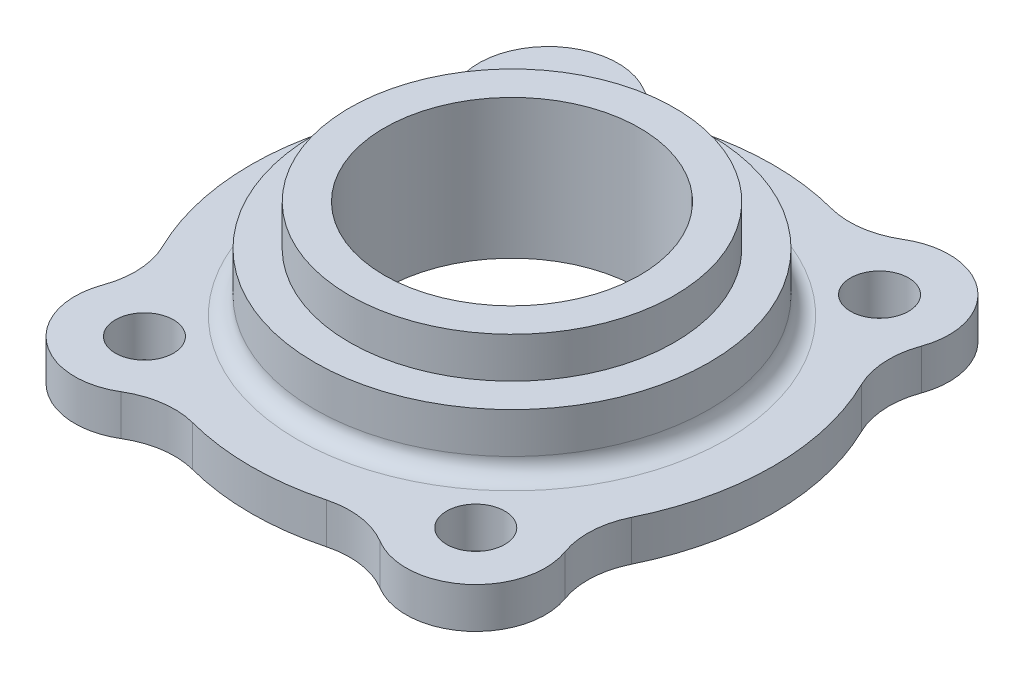
ISO-10303-21;
HEADER;
FILE_DESCRIPTION(('STEP AP214'),'2;1');
FILE_NAME('part.step','',(''),(''),'','','');
FILE_SCHEMA(('AUTOMOTIVE_DESIGN { 1 0 10303 214 1 1 1 1 }'));
ENDSEC;
DATA;
#1=APPLICATION_CONTEXT('core data for automotive mechanical design processes');
#2=APPLICATION_PROTOCOL_DEFINITION('international standard','automotive_design',2000,#1);
#3=PRODUCT_CONTEXT('',#1,'mechanical');
#4=PRODUCT('Part','Part','',(#3));
#5=PRODUCT_RELATED_PRODUCT_CATEGORY('part','',(#4));
#6=PRODUCT_DEFINITION_FORMATION('','',#4);
#7=PRODUCT_DEFINITION_CONTEXT('part definition',#1,'design');
#8=PRODUCT_DEFINITION('design','',#6,#7);
#9=PRODUCT_DEFINITION_SHAPE('','',#8);
#10=(LENGTH_UNIT() NAMED_UNIT(*) SI_UNIT(.MILLI.,.METRE.));
#11=(NAMED_UNIT(*) PLANE_ANGLE_UNIT() SI_UNIT($,.RADIAN.));
#12=(NAMED_UNIT(*) SI_UNIT($,.STERADIAN.) SOLID_ANGLE_UNIT());
#13=UNCERTAINTY_MEASURE_WITH_UNIT(LENGTH_MEASURE(1.E-05),#10,'distance_accuracy_value','');
#14=(GEOMETRIC_REPRESENTATION_CONTEXT(3) GLOBAL_UNCERTAINTY_ASSIGNED_CONTEXT((#13)) GLOBAL_UNIT_ASSIGNED_CONTEXT((#10,
#11,#12)) REPRESENTATION_CONTEXT('',''));
#15=CARTESIAN_POINT('',(0.,0.,0.));
#16=DIRECTION('',(0.,0.,1.));
#17=DIRECTION('',(1.,0.,0.));
#18=AXIS2_PLACEMENT_3D('',#15,#16,#17);
#19=CARTESIAN_POINT('',(0.,12.,0.));
#20=DIRECTION('',(0.,-1.,0.));
#21=DIRECTION('',(0.,0.,-1.));
#22=AXIS2_PLACEMENT_3D('',#19,#20,#21);
#23=CYLINDRICAL_SURFACE('',#22,11.);
#24=CARTESIAN_POINT('',(0.,12.,0.));
#25=DIRECTION('',(0.,1.,0.));
#26=DIRECTION('',(0.,0.,1.));
#27=AXIS2_PLACEMENT_3D('',#24,#25,#26);
#28=CIRCLE('',#27,11.);
#29=CARTESIAN_POINT('',(0.,12.,11.));
#30=VERTEX_POINT('',#29);
#31=EDGE_CURVE('E232',#30,#30,#28,.T.);
#32=ORIENTED_EDGE('',*,*,#31,.T.);
#33=EDGE_LOOP('',(#32));
#34=FACE_BOUND('',#33,.T.);
#35=CARTESIAN_POINT('',(0.,0.,0.));
#36=DIRECTION('',(0.,1.,0.));
#37=DIRECTION('',(0.,0.,1.));
#38=AXIS2_PLACEMENT_3D('',#35,#36,#37);
#39=CIRCLE('',#38,11.);
#40=CARTESIAN_POINT('',(0.,0.,11.));
#41=VERTEX_POINT('',#40);
#42=EDGE_CURVE('E231',#41,#41,#39,.T.);
#43=ORIENTED_EDGE('',*,*,#42,.F.);
#44=EDGE_LOOP('',(#43));
#45=FACE_BOUND('',#44,.T.);
#46=ADVANCED_FACE('F43',(#34,#45),#23,.F.);
#47=CARTESIAN_POINT('',(0.,12.,0.));
#48=DIRECTION('',(0.,-1.,0.));
#49=DIRECTION('',(0.,0.,-1.));
#50=AXIS2_PLACEMENT_3D('',#47,#48,#49);
#51=CYLINDRICAL_SURFACE('',#50,14.);
#52=CARTESIAN_POINT('',(0.,8.5,0.));
#53=DIRECTION('',(0.,1.,0.));
#54=DIRECTION('',(0.,0.,1.));
#55=AXIS2_PLACEMENT_3D('',#52,#53,#54);
#56=CIRCLE('',#55,14.);
#57=CARTESIAN_POINT('',(0.,8.5,14.));
#58=VERTEX_POINT('',#57);
#59=EDGE_CURVE('E223',#58,#58,#56,.T.);
#60=ORIENTED_EDGE('',*,*,#59,.T.);
#61=EDGE_LOOP('',(#60));
#62=FACE_BOUND('',#61,.T.);
#63=CARTESIAN_POINT('',(0.,12.,0.));
#64=DIRECTION('',(0.,1.,0.));
#65=DIRECTION('',(0.,0.,1.));
#66=AXIS2_PLACEMENT_3D('',#63,#64,#65);
#67=CIRCLE('',#66,14.);
#68=CARTESIAN_POINT('',(0.,12.,14.));
#69=VERTEX_POINT('',#68);
#70=EDGE_CURVE('E236',#69,#69,#67,.T.);
#71=ORIENTED_EDGE('',*,*,#70,.F.);
#72=EDGE_LOOP('',(#71));
#73=FACE_BOUND('',#72,.T.);
#74=ADVANCED_FACE('F421',(#62,#73),#51,.T.);
#75=CARTESIAN_POINT('',(0.,12.,0.));
#76=DIRECTION('',(0.,1.,0.));
#77=DIRECTION('',(0.,0.,1.));
#78=AXIS2_PLACEMENT_3D('',#75,#76,#77);
#79=PLANE('',#78);
#80=ORIENTED_EDGE('',*,*,#31,.F.);
#81=EDGE_LOOP('',(#80));
#82=FACE_BOUND('',#81,.T.);
#83=ORIENTED_EDGE('',*,*,#70,.T.);
#84=EDGE_LOOP('',(#83));
#85=FACE_BOUND('',#84,.T.);
#86=ADVANCED_FACE('F427',(#82,#85),#79,.T.);
#87=CARTESIAN_POINT('',(0.,0.,0.));
#88=DIRECTION('',(0.,1.,0.));
#89=DIRECTION('',(0.,0.,1.));
#90=AXIS2_PLACEMENT_3D('',#87,#88,#89);
#91=PLANE('',#90);
#92=ORIENTED_EDGE('',*,*,#42,.T.);
#93=EDGE_LOOP('',(#92));
#94=FACE_BOUND('',#93,.T.);
#95=CARTESIAN_POINT('',(0.,0.,0.));
#96=DIRECTION('',(0.,1.,0.));
#97=DIRECTION('',(0.,0.,1.));
#98=AXIS2_PLACEMENT_3D('',#95,#96,#97);
#99=CIRCLE('',#98,22.5);
#100=CARTESIAN_POINT('',(-5.75422966979241,0.,21.7517548925893));
#101=VERTEX_POINT('',#100);
#102=CARTESIAN_POINT('',(5.75422966979241,0.,21.7517548925893));
#103=VERTEX_POINT('',#102);
#104=EDGE_CURVE('E174',#101,#103,#99,.T.);
#105=ORIENTED_EDGE('',*,*,#104,.F.);
#106=CARTESIAN_POINT('',(-7.54443445595005,0.,28.5189675258393));
#107=DIRECTION('',(0.,1.,0.));
#108=DIRECTION('',(0.,0.,1.));
#109=AXIS2_PLACEMENT_3D('',#106,#107,#108);
#110=CIRCLE('',#109,7.);
#111=CARTESIAN_POINT('',(-11.1666398852666,0.,22.5290069393387));
#112=VERTEX_POINT('',#111);
#113=EDGE_CURVE('E157',#101,#112,#110,.T.);
#114=ORIENTED_EDGE('',*,*,#113,.T.);
#115=CARTESIAN_POINT('',(-14.2713873961094,0.,17.3947550080526));
#116=DIRECTION('',(0.,1.,0.));
#117=DIRECTION('',(0.,0.,1.));
#118=AXIS2_PLACEMENT_3D('',#115,#116,#117);
#119=CIRCLE('',#118,6.00000000000001);
#120=CARTESIAN_POINT('',(-19.9132704440383,0.,15.3529039670869));
#121=VERTEX_POINT('',#120);
#122=EDGE_CURVE('E220',#121,#112,#119,.T.);
#123=ORIENTED_EDGE('',*,*,#122,.F.);
#124=CARTESIAN_POINT('',(-26.4954673332886,0.,12.9707444192935));
#125=DIRECTION('',(0.,1.,0.));
#126=DIRECTION('',(0.,0.,1.));
#127=AXIS2_PLACEMENT_3D('',#124,#125,#126);
#128=CIRCLE('',#127,7.);
#129=CARTESIAN_POINT('',(-20.2084072881015,0.,9.89294065878321));
#130=VERTEX_POINT('',#129);
#131=EDGE_CURVE('E318',#121,#130,#128,.T.);
#132=ORIENTED_EDGE('',*,*,#131,.T.);
#133=CARTESIAN_POINT('',(0.,0.,0.));
#134=DIRECTION('',(0.,1.,0.));
#135=DIRECTION('',(0.,0.,1.));
#136=AXIS2_PLACEMENT_3D('',#133,#134,#135);
#137=CIRCLE('',#136,22.5);
#138=CARTESIAN_POINT('',(-20.2084072881015,0.,-9.89294065878322));
#139=VERTEX_POINT('',#138);
#140=EDGE_CURVE('E216',#139,#130,#137,.T.);
#141=ORIENTED_EDGE('',*,*,#140,.F.);
#142=CARTESIAN_POINT('',(-26.4954673332886,0.,-12.9707444192936));
#143=DIRECTION('',(0.,1.,0.));
#144=DIRECTION('',(0.,0.,1.));
#145=AXIS2_PLACEMENT_3D('',#142,#143,#144);
#146=CIRCLE('',#145,7.);
#147=CARTESIAN_POINT('',(-19.9132704440383,0.,-15.3529039670869));
#148=VERTEX_POINT('',#147);
#149=EDGE_CURVE('E324',#139,#148,#146,.T.);
#150=ORIENTED_EDGE('',*,*,#149,.T.);
#151=CARTESIAN_POINT('',(-14.2713873961094,0.,-17.3947550080526));
#152=DIRECTION('',(0.,1.,0.));
#153=DIRECTION('',(0.,0.,1.));
#154=AXIS2_PLACEMENT_3D('',#151,#152,#153);
#155=CIRCLE('',#154,5.99999999999999);
#156=CARTESIAN_POINT('',(-11.1666398852666,0.,-22.5290069393387));
#157=VERTEX_POINT('',#156);
#158=EDGE_CURVE('E212',#157,#148,#155,.T.);
#159=ORIENTED_EDGE('',*,*,#158,.F.);
#160=CARTESIAN_POINT('',(-7.54443445595007,0.,-28.5189675258392));
#161=DIRECTION('',(0.,1.,0.));
#162=DIRECTION('',(0.,0.,1.));
#163=AXIS2_PLACEMENT_3D('',#160,#161,#162);
#164=CIRCLE('',#163,7.);
#165=CARTESIAN_POINT('',(-5.75422966979243,0.,-21.7517548925893));
#166=VERTEX_POINT('',#165);
#167=EDGE_CURVE('E312',#157,#166,#164,.T.);
#168=ORIENTED_EDGE('',*,*,#167,.T.);
#169=CARTESIAN_POINT('',(0.,0.,0.));
#170=DIRECTION('',(0.,1.,0.));
#171=DIRECTION('',(0.,0.,1.));
#172=AXIS2_PLACEMENT_3D('',#169,#170,#171);
#173=CIRCLE('',#172,22.5);
#174=CARTESIAN_POINT('',(5.7542296697924,0.,-21.7517548925893));
#175=VERTEX_POINT('',#174);
#176=EDGE_CURVE('E208',#175,#166,#173,.T.);
#177=ORIENTED_EDGE('',*,*,#176,.F.);
#178=CARTESIAN_POINT('',(7.54443445595004,0.,-28.5189675258393));
#179=DIRECTION('',(0.,1.,0.));
#180=DIRECTION('',(0.,0.,1.));
#181=AXIS2_PLACEMENT_3D('',#178,#179,#180);
#182=CIRCLE('',#181,7.);
#183=CARTESIAN_POINT('',(11.1666398852666,0.,-22.5290069393387));
#184=VERTEX_POINT('',#183);
#185=EDGE_CURVE('E306',#175,#184,#182,.T.);
#186=ORIENTED_EDGE('',*,*,#185,.T.);
#187=CARTESIAN_POINT('',(14.2713873961094,0.,-17.3947550080526));
#188=DIRECTION('',(0.,1.,0.));
#189=DIRECTION('',(0.,0.,1.));
#190=AXIS2_PLACEMENT_3D('',#187,#188,#189);
#191=CIRCLE('',#190,6.00000000000001);
#192=CARTESIAN_POINT('',(19.9132704440383,0.,-15.3529039670869));
#193=VERTEX_POINT('',#192);
#194=EDGE_CURVE('E204',#193,#184,#191,.T.);
#195=ORIENTED_EDGE('',*,*,#194,.F.);
#196=CARTESIAN_POINT('',(26.4954673332886,0.,-12.9707444192935));
#197=DIRECTION('',(0.,1.,0.));
#198=DIRECTION('',(0.,0.,1.));
#199=AXIS2_PLACEMENT_3D('',#196,#197,#198);
#200=CIRCLE('',#199,7.);
#201=CARTESIAN_POINT('',(20.2084072881015,0.,-9.89294065878321));
#202=VERTEX_POINT('',#201);
#203=EDGE_CURVE('E330',#193,#202,#200,.T.);
#204=ORIENTED_EDGE('',*,*,#203,.T.);
#205=CARTESIAN_POINT('',(0.,0.,0.));
#206=DIRECTION('',(0.,1.,0.));
#207=DIRECTION('',(0.,0.,1.));
#208=AXIS2_PLACEMENT_3D('',#205,#206,#207);
#209=CIRCLE('',#208,22.5);
#210=CARTESIAN_POINT('',(20.2084072881015,0.,9.89294065878321));
#211=VERTEX_POINT('',#210);
#212=EDGE_CURVE('E193',#211,#202,#209,.T.);
#213=ORIENTED_EDGE('',*,*,#212,.F.);
#214=CARTESIAN_POINT('',(26.4954673332886,0.,12.9707444192935));
#215=DIRECTION('',(0.,1.,0.));
#216=DIRECTION('',(0.,0.,1.));
#217=AXIS2_PLACEMENT_3D('',#214,#215,#216);
#218=CIRCLE('',#217,7.);
#219=CARTESIAN_POINT('',(19.9132704440383,0.,15.3529039670869));
#220=VERTEX_POINT('',#219);
#221=EDGE_CURVE('E52',#211,#220,#218,.T.);
#222=ORIENTED_EDGE('',*,*,#221,.T.);
#223=CARTESIAN_POINT('',(14.2713873961094,0.,17.3947550080526));
#224=DIRECTION('',(0.,1.,0.));
#225=DIRECTION('',(0.,0.,1.));
#226=AXIS2_PLACEMENT_3D('',#223,#224,#225);
#227=CIRCLE('',#226,6.00000000000001);
#228=CARTESIAN_POINT('',(11.1666398852666,0.,22.5290069393387));
#229=VERTEX_POINT('',#228);
#230=EDGE_CURVE('E187',#229,#220,#227,.T.);
#231=ORIENTED_EDGE('',*,*,#230,.F.);
#232=CARTESIAN_POINT('',(7.54443445595005,0.,28.5189675258393));
#233=DIRECTION('',(0.,1.,0.));
#234=DIRECTION('',(0.,0.,1.));
#235=AXIS2_PLACEMENT_3D('',#232,#233,#234);
#236=CIRCLE('',#235,7.);
#237=EDGE_CURVE('E185',#229,#103,#236,.T.);
#238=ORIENTED_EDGE('',*,*,#237,.T.);
#239=EDGE_LOOP('',(#105,#114,#123,#132,#141,#150,#159,#168,#177,#186,#195,#204,#213,#222,#231,#238));
#240=FACE_BOUND('',#239,.T.);
#241=CARTESIAN_POINT('',(-14.2713873961094,0.,-17.3947550080526));
#242=DIRECTION('',(0.,1.,0.));
#243=DIRECTION('',(0.,0.,1.));
#244=AXIS2_PLACEMENT_3D('',#241,#242,#243);
#245=CIRCLE('',#244,2.5);
#246=CARTESIAN_POINT('',(-14.2713873961094,0.,-14.8947550080526));
#247=VERTEX_POINT('',#246);
#248=EDGE_CURVE('E196',#247,#247,#245,.T.);
#249=ORIENTED_EDGE('',*,*,#248,.T.);
#250=EDGE_LOOP('',(#249));
#251=FACE_BOUND('',#250,.T.);
#252=CARTESIAN_POINT('',(14.2713873961094,0.,-17.3947550080526));
#253=DIRECTION('',(0.,1.,0.));
#254=DIRECTION('',(0.,0.,1.));
#255=AXIS2_PLACEMENT_3D('',#252,#253,#254);
#256=CIRCLE('',#255,2.5);
#257=CARTESIAN_POINT('',(14.2713873961094,0.,-14.8947550080526));
#258=VERTEX_POINT('',#257);
#259=EDGE_CURVE('E687',#258,#258,#256,.T.);
#260=ORIENTED_EDGE('',*,*,#259,.T.);
#261=EDGE_LOOP('',(#260));
#262=FACE_BOUND('',#261,.T.);
#263=CARTESIAN_POINT('',(-14.2713873961094,0.,17.3947550080526));
#264=DIRECTION('',(0.,1.,0.));
#265=DIRECTION('',(0.,0.,1.));
#266=AXIS2_PLACEMENT_3D('',#263,#264,#265);
#267=CIRCLE('',#266,2.5);
#268=CARTESIAN_POINT('',(-14.2713873961094,0.,19.8947550080526));
#269=VERTEX_POINT('',#268);
#270=EDGE_CURVE('E697',#269,#269,#267,.T.);
#271=ORIENTED_EDGE('',*,*,#270,.T.);
#272=EDGE_LOOP('',(#271));
#273=FACE_BOUND('',#272,.T.);
#274=CARTESIAN_POINT('',(14.2713873961094,0.,17.3947550080526));
#275=DIRECTION('',(0.,1.,0.));
#276=DIRECTION('',(0.,0.,1.));
#277=AXIS2_PLACEMENT_3D('',#274,#275,#276);
#278=CIRCLE('',#277,2.5);
#279=CARTESIAN_POINT('',(14.2713873961094,0.,19.8947550080526));
#280=VERTEX_POINT('',#279);
#281=EDGE_CURVE('E706',#280,#280,#278,.T.);
#282=ORIENTED_EDGE('',*,*,#281,.T.);
#283=EDGE_LOOP('',(#282));
#284=FACE_BOUND('',#283,.T.);
#285=ADVANCED_FACE('F182',(#94,#240,#251,#262,#273,#284),#91,.F.);
#286=CARTESIAN_POINT('',(0.,8.5,0.));
#287=DIRECTION('',(0.,1.,0.));
#288=DIRECTION('',(0.,0.,1.));
#289=AXIS2_PLACEMENT_3D('',#286,#287,#288);
#290=PLANE('',#289);
#291=CARTESIAN_POINT('',(0.,8.5,0.));
#292=DIRECTION('',(0.,1.,0.));
#293=DIRECTION('',(0.,0.,1.));
#294=AXIS2_PLACEMENT_3D('',#291,#292,#293);
#295=CIRCLE('',#294,17.);
#296=CARTESIAN_POINT('',(0.,8.5,17.));
#297=VERTEX_POINT('',#296);
#298=EDGE_CURVE('E227',#297,#297,#295,.T.);
#299=ORIENTED_EDGE('',*,*,#298,.T.);
#300=EDGE_LOOP('',(#299));
#301=FACE_BOUND('',#300,.T.);
#302=ORIENTED_EDGE('',*,*,#59,.F.);
#303=EDGE_LOOP('',(#302));
#304=FACE_BOUND('',#303,.T.);
#305=ADVANCED_FACE('F606',(#301,#304),#290,.T.);
#306=CARTESIAN_POINT('',(0.,8.5,0.));
#307=DIRECTION('',(0.,-1.,0.));
#308=DIRECTION('',(0.,0.,-1.));
#309=AXIS2_PLACEMENT_3D('',#306,#307,#308);
#310=CYLINDRICAL_SURFACE('',#309,17.);
#311=CARTESIAN_POINT('',(0.,5.,0.));
#312=DIRECTION('',(0.,1.,0.));
#313=DIRECTION('',(0.,0.,1.));
#314=AXIS2_PLACEMENT_3D('',#311,#312,#313);
#315=CIRCLE('',#314,17.);
#316=CARTESIAN_POINT('',(0.,5.,17.));
#317=VERTEX_POINT('',#316);
#318=EDGE_CURVE('E240',#317,#317,#315,.T.);
#319=ORIENTED_EDGE('',*,*,#318,.T.);
#320=EDGE_LOOP('',(#319));
#321=FACE_BOUND('',#320,.T.);
#322=ORIENTED_EDGE('',*,*,#298,.F.);
#323=EDGE_LOOP('',(#322));
#324=FACE_BOUND('',#323,.T.);
#325=ADVANCED_FACE('F597',(#321,#324),#310,.T.);
#326=CARTESIAN_POINT('',(7.1356936980547,3.5,8.69737750402629));
#327=DIRECTION('',(0.,1.,0.));
#328=DIRECTION('',(0.,0.,1.));
#329=AXIS2_PLACEMENT_3D('',#326,#327,#328);
#330=PLANE('',#329);
#331=CARTESIAN_POINT('',(0.,3.5,0.));
#332=DIRECTION('',(0.,1.,0.));
#333=DIRECTION('',(0.,0.,1.));
#334=AXIS2_PLACEMENT_3D('',#331,#332,#333);
#335=CIRCLE('',#334,18.5);
#336=CARTESIAN_POINT('',(0.,3.5,18.5));
#337=VERTEX_POINT('',#336);
#338=EDGE_CURVE('E247',#337,#337,#335,.F.);
#339=ORIENTED_EDGE('',*,*,#338,.T.);
#340=EDGE_LOOP('',(#339));
#341=FACE_BOUND('',#340,.T.);
#342=CARTESIAN_POINT('',(14.2713873961094,3.5,17.3947550080526));
#343=DIRECTION('',(0.,1.,0.));
#344=DIRECTION('',(0.,0.,1.));
#345=AXIS2_PLACEMENT_3D('',#342,#343,#344);
#346=CIRCLE('',#345,2.5);
#347=CARTESIAN_POINT('',(14.2713873961094,3.5,19.8947550080526));
#348=VERTEX_POINT('',#347);
#349=EDGE_CURVE('E682',#348,#348,#346,.T.);
#350=ORIENTED_EDGE('',*,*,#349,.F.);
#351=EDGE_LOOP('',(#350));
#352=FACE_BOUND('',#351,.T.);
#353=CARTESIAN_POINT('',(14.2713873961094,3.5,-17.3947550080526));
#354=DIRECTION('',(0.,1.,0.));
#355=DIRECTION('',(0.,0.,1.));
#356=AXIS2_PLACEMENT_3D('',#353,#354,#355);
#357=CIRCLE('',#356,2.5);
#358=CARTESIAN_POINT('',(14.2713873961094,3.5,-14.8947550080526));
#359=VERTEX_POINT('',#358);
#360=EDGE_CURVE('E685',#359,#359,#357,.T.);
#361=ORIENTED_EDGE('',*,*,#360,.F.);
#362=EDGE_LOOP('',(#361));
#363=FACE_BOUND('',#362,.T.);
#364=CARTESIAN_POINT('',(-14.2713873961094,3.5,17.3947550080526));
#365=DIRECTION('',(0.,1.,0.));
#366=DIRECTION('',(0.,0.,1.));
#367=AXIS2_PLACEMENT_3D('',#364,#365,#366);
#368=CIRCLE('',#367,6.00000000000001);
#369=CARTESIAN_POINT('',(-19.9132704440383,3.5,15.3529039670869));
#370=VERTEX_POINT('',#369);
#371=CARTESIAN_POINT('',(-11.1666398852666,3.5,22.5290069393387));
#372=VERTEX_POINT('',#371);
#373=EDGE_CURVE('E199',#370,#372,#368,.T.);
#374=ORIENTED_EDGE('',*,*,#373,.T.);
#375=CARTESIAN_POINT('',(-7.54443445595005,3.5,28.5189675258393));
#376=DIRECTION('',(0.,1.,0.));
#377=DIRECTION('',(0.,0.,1.));
#378=AXIS2_PLACEMENT_3D('',#375,#376,#377);
#379=CIRCLE('',#378,7.);
#380=CARTESIAN_POINT('',(-5.75422966979241,3.5,21.7517548925893));
#381=VERTEX_POINT('',#380);
#382=EDGE_CURVE('E168',#372,#381,#379,.F.);
#383=ORIENTED_EDGE('',*,*,#382,.T.);
#384=CARTESIAN_POINT('',(0.,3.5,0.));
#385=DIRECTION('',(0.,1.,0.));
#386=DIRECTION('',(0.,0.,1.));
#387=AXIS2_PLACEMENT_3D('',#384,#385,#386);
#388=CIRCLE('',#387,22.5);
#389=CARTESIAN_POINT('',(5.75422966979241,3.5,21.7517548925893));
#390=VERTEX_POINT('',#389);
#391=EDGE_CURVE('E177',#381,#390,#388,.T.);
#392=ORIENTED_EDGE('',*,*,#391,.T.);
#393=CARTESIAN_POINT('',(7.54443445595005,3.5,28.5189675258393));
#394=DIRECTION('',(0.,1.,0.));
#395=DIRECTION('',(0.,0.,1.));
#396=AXIS2_PLACEMENT_3D('',#393,#394,#395);
#397=CIRCLE('',#396,7.);
#398=CARTESIAN_POINT('',(11.1666398852666,3.5,22.5290069393387));
#399=VERTEX_POINT('',#398);
#400=EDGE_CURVE('E303',#390,#399,#397,.F.);
#401=ORIENTED_EDGE('',*,*,#400,.T.);
#402=CARTESIAN_POINT('',(14.2713873961094,3.5,17.3947550080526));
#403=DIRECTION('',(0.,1.,0.));
#404=DIRECTION('',(0.,0.,1.));
#405=AXIS2_PLACEMENT_3D('',#402,#403,#404);
#406=CIRCLE('',#405,6.00000000000001);
#407=CARTESIAN_POINT('',(19.9132704440383,3.5,15.3529039670869));
#408=VERTEX_POINT('',#407);
#409=EDGE_CURVE('E349',#399,#408,#406,.T.);
#410=ORIENTED_EDGE('',*,*,#409,.T.);
#411=CARTESIAN_POINT('',(26.4954673332886,3.5,12.9707444192935));
#412=DIRECTION('',(0.,1.,0.));
#413=DIRECTION('',(0.,0.,1.));
#414=AXIS2_PLACEMENT_3D('',#411,#412,#413);
#415=CIRCLE('',#414,7.);
#416=CARTESIAN_POINT('',(20.2084072881015,3.5,9.89294065878321));
#417=VERTEX_POINT('',#416);
#418=EDGE_CURVE('E11',#408,#417,#415,.F.);
#419=ORIENTED_EDGE('',*,*,#418,.T.);
#420=CARTESIAN_POINT('',(0.,3.5,0.));
#421=DIRECTION('',(0.,1.,0.));
#422=DIRECTION('',(0.,0.,1.));
#423=AXIS2_PLACEMENT_3D('',#420,#421,#422);
#424=CIRCLE('',#423,22.5);
#425=CARTESIAN_POINT('',(20.2084072881015,3.5,-9.89294065878321));
#426=VERTEX_POINT('',#425);
#427=EDGE_CURVE('E345',#417,#426,#424,.T.);
#428=ORIENTED_EDGE('',*,*,#427,.T.);
#429=CARTESIAN_POINT('',(26.4954673332886,3.5,-12.9707444192935));
#430=DIRECTION('',(0.,1.,0.));
#431=DIRECTION('',(0.,0.,1.));
#432=AXIS2_PLACEMENT_3D('',#429,#430,#431);
#433=CIRCLE('',#432,7.);
#434=CARTESIAN_POINT('',(19.9132704440383,3.5,-15.3529039670869));
#435=VERTEX_POINT('',#434);
#436=EDGE_CURVE('E333',#426,#435,#433,.F.);
#437=ORIENTED_EDGE('',*,*,#436,.T.);
#438=CARTESIAN_POINT('',(14.2713873961094,3.5,-17.3947550080526));
#439=DIRECTION('',(0.,1.,0.));
#440=DIRECTION('',(0.,0.,1.));
#441=AXIS2_PLACEMENT_3D('',#438,#439,#440);
#442=CIRCLE('',#441,6.00000000000001);
#443=CARTESIAN_POINT('',(11.1666398852666,3.5,-22.5290069393387));
#444=VERTEX_POINT('',#443);
#445=EDGE_CURVE('E348',#435,#444,#442,.T.);
#446=ORIENTED_EDGE('',*,*,#445,.T.);
#447=CARTESIAN_POINT('',(7.54443445595004,3.5,-28.5189675258393));
#448=DIRECTION('',(0.,1.,0.));
#449=DIRECTION('',(0.,0.,1.));
#450=AXIS2_PLACEMENT_3D('',#447,#448,#449);
#451=CIRCLE('',#450,7.);
#452=CARTESIAN_POINT('',(5.7542296697924,3.5,-21.7517548925893));
#453=VERTEX_POINT('',#452);
#454=EDGE_CURVE('E309',#444,#453,#451,.F.);
#455=ORIENTED_EDGE('',*,*,#454,.T.);
#456=CARTESIAN_POINT('',(0.,3.5,0.));
#457=DIRECTION('',(0.,1.,0.));
#458=DIRECTION('',(0.,0.,1.));
#459=AXIS2_PLACEMENT_3D('',#456,#457,#458);
#460=CIRCLE('',#459,22.5);
#461=CARTESIAN_POINT('',(-5.75422966979243,3.5,-21.7517548925893));
#462=VERTEX_POINT('',#461);
#463=EDGE_CURVE('E354',#453,#462,#460,.T.);
#464=ORIENTED_EDGE('',*,*,#463,.T.);
#465=CARTESIAN_POINT('',(-7.54443445595007,3.5,-28.5189675258392));
#466=DIRECTION('',(0.,1.,0.));
#467=DIRECTION('',(0.,0.,1.));
#468=AXIS2_PLACEMENT_3D('',#465,#466,#467);
#469=CIRCLE('',#468,7.);
#470=CARTESIAN_POINT('',(-11.1666398852666,3.5,-22.5290069393387));
#471=VERTEX_POINT('',#470);
#472=EDGE_CURVE('E315',#462,#471,#469,.F.);
#473=ORIENTED_EDGE('',*,*,#472,.T.);
#474=CARTESIAN_POINT('',(-14.2713873961094,3.5,-17.3947550080526));
#475=DIRECTION('',(0.,1.,0.));
#476=DIRECTION('',(0.,0.,1.));
#477=AXIS2_PLACEMENT_3D('',#474,#475,#476);
#478=CIRCLE('',#477,5.99999999999999);
#479=CARTESIAN_POINT('',(-19.9132704440383,3.5,-15.3529039670869));
#480=VERTEX_POINT('',#479);
#481=EDGE_CURVE('E362',#471,#480,#478,.T.);
#482=ORIENTED_EDGE('',*,*,#481,.T.);
#483=CARTESIAN_POINT('',(-26.4954673332886,3.5,-12.9707444192936));
#484=DIRECTION('',(0.,1.,0.));
#485=DIRECTION('',(0.,0.,1.));
#486=AXIS2_PLACEMENT_3D('',#483,#484,#485);
#487=CIRCLE('',#486,7.);
#488=CARTESIAN_POINT('',(-20.2084072881015,3.5,-9.89294065878322));
#489=VERTEX_POINT('',#488);
#490=EDGE_CURVE('E327',#480,#489,#487,.F.);
#491=ORIENTED_EDGE('',*,*,#490,.T.);
#492=CARTESIAN_POINT('',(0.,3.5,0.));
#493=DIRECTION('',(0.,1.,0.));
#494=DIRECTION('',(0.,0.,1.));
#495=AXIS2_PLACEMENT_3D('',#492,#493,#494);
#496=CIRCLE('',#495,22.5);
#497=CARTESIAN_POINT('',(-20.2084072881015,3.5,9.89294065878321));
#498=VERTEX_POINT('',#497);
#499=EDGE_CURVE('E365',#489,#498,#496,.T.);
#500=ORIENTED_EDGE('',*,*,#499,.T.);
#501=CARTESIAN_POINT('',(-26.4954673332886,3.5,12.9707444192935));
#502=DIRECTION('',(0.,1.,0.));
#503=DIRECTION('',(0.,0.,1.));
#504=AXIS2_PLACEMENT_3D('',#501,#502,#503);
#505=CIRCLE('',#504,7.);
#506=EDGE_CURVE('E321',#498,#370,#505,.F.);
#507=ORIENTED_EDGE('',*,*,#506,.T.);
#508=EDGE_LOOP('',(#374,#383,#392,#401,#410,#419,#428,#437,#446,#455,#464,#473,#482,#491,#500,#507));
#509=FACE_BOUND('',#508,.T.);
#510=CARTESIAN_POINT('',(-14.2713873961094,3.5,-17.3947550080526));
#511=DIRECTION('',(0.,1.,0.));
#512=DIRECTION('',(0.,0.,1.));
#513=AXIS2_PLACEMENT_3D('',#510,#511,#512);
#514=CIRCLE('',#513,2.5);
#515=CARTESIAN_POINT('',(-14.2713873961094,3.5,-14.8947550080526));
#516=VERTEX_POINT('',#515);
#517=EDGE_CURVE('E188',#516,#516,#514,.T.);
#518=ORIENTED_EDGE('',*,*,#517,.F.);
#519=EDGE_LOOP('',(#518));
#520=FACE_BOUND('',#519,.T.);
#521=CARTESIAN_POINT('',(-14.2713873961094,3.5,17.3947550080526));
#522=DIRECTION('',(0.,1.,0.));
#523=DIRECTION('',(0.,0.,1.));
#524=AXIS2_PLACEMENT_3D('',#521,#522,#523);
#525=CIRCLE('',#524,2.5);
#526=CARTESIAN_POINT('',(-14.2713873961094,3.5,19.8947550080526));
#527=VERTEX_POINT('',#526);
#528=EDGE_CURVE('E694',#527,#527,#525,.T.);
#529=ORIENTED_EDGE('',*,*,#528,.F.);
#530=EDGE_LOOP('',(#529));
#531=FACE_BOUND('',#530,.T.);
#532=ADVANCED_FACE('F373',(#341,#352,#363,#509,#520,#531),#330,.T.);
#533=CARTESIAN_POINT('',(0.,3.5,0.));
#534=DIRECTION('',(0.,-1.,0.));
#535=DIRECTION('',(0.,0.,-1.));
#536=AXIS2_PLACEMENT_3D('',#533,#534,#535);
#537=CYLINDRICAL_SURFACE('',#536,22.5);
#538=ORIENTED_EDGE('',*,*,#391,.F.);
#539=DIRECTION('',(0.,-1.,0.));
#540=VECTOR('',#539,1.);
#541=CARTESIAN_POINT('',(-5.75422966979241,3.5,21.7517548925893));
#542=LINE('',#541,#540);
#543=EDGE_CURVE('E161',#381,#101,#542,.T.);
#544=ORIENTED_EDGE('',*,*,#543,.T.);
#545=ORIENTED_EDGE('',*,*,#104,.T.);
#546=DIRECTION('',(0.,-1.,0.));
#547=VECTOR('',#546,1.);
#548=CARTESIAN_POINT('',(5.75422966979241,3.5,21.7517548925893));
#549=LINE('',#548,#547);
#550=EDGE_CURVE('E180',#103,#390,#549,.F.);
#551=ORIENTED_EDGE('',*,*,#550,.T.);
#552=EDGE_LOOP('',(#538,#544,#545,#551));
#553=FACE_BOUND('',#552,.T.);
#554=ADVANCED_FACE('F173',(#553),#537,.T.);
#555=CARTESIAN_POINT('',(14.2713873961094,3.5,17.3947550080526));
#556=DIRECTION('',(0.,-1.,0.));
#557=DIRECTION('',(0.,0.,-1.));
#558=AXIS2_PLACEMENT_3D('',#555,#556,#557);
#559=CYLINDRICAL_SURFACE('',#558,6.00000000000001);
#560=ORIENTED_EDGE('',*,*,#409,.F.);
#561=DIRECTION('',(0.,-1.,0.));
#562=VECTOR('',#561,1.);
#563=CARTESIAN_POINT('',(11.1666398852666,3.5,22.5290069393387));
#564=LINE('',#563,#562);
#565=EDGE_CURVE('E261',#399,#229,#564,.T.);
#566=ORIENTED_EDGE('',*,*,#565,.T.);
#567=ORIENTED_EDGE('',*,*,#230,.T.);
#568=DIRECTION('',(0.,-1.,0.));
#569=VECTOR('',#568,1.);
#570=CARTESIAN_POINT('',(19.9132704440383,3.5,15.3529039670869));
#571=LINE('',#570,#569);
#572=EDGE_CURVE('E258',#220,#408,#571,.F.);
#573=ORIENTED_EDGE('',*,*,#572,.T.);
#574=EDGE_LOOP('',(#560,#566,#567,#573));
#575=FACE_BOUND('',#574,.T.);
#576=ADVANCED_FACE('F342',(#575),#559,.T.);
#577=CARTESIAN_POINT('',(0.,3.5,0.));
#578=DIRECTION('',(0.,-1.,0.));
#579=DIRECTION('',(0.,0.,-1.));
#580=AXIS2_PLACEMENT_3D('',#577,#578,#579);
#581=CYLINDRICAL_SURFACE('',#580,22.5);
#582=ORIENTED_EDGE('',*,*,#212,.T.);
#583=DIRECTION('',(0.,-1.,0.));
#584=VECTOR('',#583,1.);
#585=CARTESIAN_POINT('',(20.2084072881015,3.5,-9.89294065878321));
#586=LINE('',#585,#584);
#587=EDGE_CURVE('E59',#202,#426,#586,.F.);
#588=ORIENTED_EDGE('',*,*,#587,.T.);
#589=ORIENTED_EDGE('',*,*,#427,.F.);
#590=DIRECTION('',(0.,-1.,0.));
#591=VECTOR('',#590,1.);
#592=CARTESIAN_POINT('',(20.2084072881015,3.5,9.89294065878321));
#593=LINE('',#592,#591);
#594=EDGE_CURVE('E293',#417,#211,#593,.T.);
#595=ORIENTED_EDGE('',*,*,#594,.T.);
#596=EDGE_LOOP('',(#582,#588,#589,#595));
#597=FACE_BOUND('',#596,.T.);
#598=ADVANCED_FACE('F344',(#597),#581,.T.);
#599=CARTESIAN_POINT('',(14.2713873961094,3.5,-17.3947550080526));
#600=DIRECTION('',(0.,-1.,0.));
#601=DIRECTION('',(0.,0.,-1.));
#602=AXIS2_PLACEMENT_3D('',#599,#600,#601);
#603=CYLINDRICAL_SURFACE('',#602,6.00000000000001);
#604=ORIENTED_EDGE('',*,*,#194,.T.);
#605=DIRECTION('',(0.,-1.,0.));
#606=VECTOR('',#605,1.);
#607=CARTESIAN_POINT('',(11.1666398852666,3.5,-22.5290069393387));
#608=LINE('',#607,#606);
#609=EDGE_CURVE('E276',#184,#444,#608,.F.);
#610=ORIENTED_EDGE('',*,*,#609,.T.);
#611=ORIENTED_EDGE('',*,*,#445,.F.);
#612=DIRECTION('',(0.,-1.,0.));
#613=VECTOR('',#612,1.);
#614=CARTESIAN_POINT('',(19.9132704440383,3.5,-15.3529039670869));
#615=LINE('',#614,#613);
#616=EDGE_CURVE('E272',#435,#193,#615,.T.);
#617=ORIENTED_EDGE('',*,*,#616,.T.);
#618=EDGE_LOOP('',(#604,#610,#611,#617));
#619=FACE_BOUND('',#618,.T.);
#620=ADVANCED_FACE('F409',(#619),#603,.T.);
#621=CARTESIAN_POINT('',(0.,3.5,0.));
#622=DIRECTION('',(0.,-1.,0.));
#623=DIRECTION('',(0.,0.,-1.));
#624=AXIS2_PLACEMENT_3D('',#621,#622,#623);
#625=CYLINDRICAL_SURFACE('',#624,22.5);
#626=ORIENTED_EDGE('',*,*,#463,.F.);
#627=DIRECTION('',(0.,-1.,0.));
#628=VECTOR('',#627,1.);
#629=CARTESIAN_POINT('',(5.7542296697924,3.5,-21.7517548925893));
#630=LINE('',#629,#628);
#631=EDGE_CURVE('E268',#453,#175,#630,.T.);
#632=ORIENTED_EDGE('',*,*,#631,.T.);
#633=ORIENTED_EDGE('',*,*,#176,.T.);
#634=DIRECTION('',(0.,-1.,0.));
#635=VECTOR('',#634,1.);
#636=CARTESIAN_POINT('',(-5.75422966979243,3.5,-21.7517548925893));
#637=LINE('',#636,#635);
#638=EDGE_CURVE('E265',#166,#462,#637,.F.);
#639=ORIENTED_EDGE('',*,*,#638,.T.);
#640=EDGE_LOOP('',(#626,#632,#633,#639));
#641=FACE_BOUND('',#640,.T.);
#642=ADVANCED_FACE('F401',(#641),#625,.T.);
#643=CARTESIAN_POINT('',(-14.2713873961094,3.5,-17.3947550080526));
#644=DIRECTION('',(0.,-1.,0.));
#645=DIRECTION('',(0.,0.,-1.));
#646=AXIS2_PLACEMENT_3D('',#643,#644,#645);
#647=CYLINDRICAL_SURFACE('',#646,5.99999999999999);
#648=ORIENTED_EDGE('',*,*,#481,.F.);
#649=DIRECTION('',(0.,-1.,0.));
#650=VECTOR('',#649,1.);
#651=CARTESIAN_POINT('',(-11.1666398852666,3.5,-22.5290069393387));
#652=LINE('',#651,#650);
#653=EDGE_CURVE('E282',#471,#157,#652,.T.);
#654=ORIENTED_EDGE('',*,*,#653,.T.);
#655=ORIENTED_EDGE('',*,*,#158,.T.);
#656=DIRECTION('',(0.,-1.,0.));
#657=VECTOR('',#656,1.);
#658=CARTESIAN_POINT('',(-19.9132704440383,3.5,-15.3529039670869));
#659=LINE('',#658,#657);
#660=EDGE_CURVE('E279',#148,#480,#659,.F.);
#661=ORIENTED_EDGE('',*,*,#660,.T.);
#662=EDGE_LOOP('',(#648,#654,#655,#661));
#663=FACE_BOUND('',#662,.T.);
#664=ADVANCED_FACE('F392',(#663),#647,.T.);
#665=CARTESIAN_POINT('',(0.,3.5,0.));
#666=DIRECTION('',(0.,-1.,0.));
#667=DIRECTION('',(0.,0.,-1.));
#668=AXIS2_PLACEMENT_3D('',#665,#666,#667);
#669=CYLINDRICAL_SURFACE('',#668,22.5);
#670=ORIENTED_EDGE('',*,*,#140,.T.);
#671=DIRECTION('',(0.,-1.,0.));
#672=VECTOR('',#671,1.);
#673=CARTESIAN_POINT('',(-20.2084072881015,3.5,9.89294065878321));
#674=LINE('',#673,#672);
#675=EDGE_CURVE('E290',#130,#498,#674,.F.);
#676=ORIENTED_EDGE('',*,*,#675,.T.);
#677=ORIENTED_EDGE('',*,*,#499,.F.);
#678=DIRECTION('',(0.,-1.,0.));
#679=VECTOR('',#678,1.);
#680=CARTESIAN_POINT('',(-20.2084072881015,3.5,-9.89294065878322));
#681=LINE('',#680,#679);
#682=EDGE_CURVE('E286',#489,#139,#681,.T.);
#683=ORIENTED_EDGE('',*,*,#682,.T.);
#684=EDGE_LOOP('',(#670,#676,#677,#683));
#685=FACE_BOUND('',#684,.T.);
#686=ADVANCED_FACE('F383',(#685),#669,.T.);
#687=CARTESIAN_POINT('',(-14.2713873961094,3.5,17.3947550080526));
#688=DIRECTION('',(0.,-1.,0.));
#689=DIRECTION('',(0.,0.,-1.));
#690=AXIS2_PLACEMENT_3D('',#687,#688,#689);
#691=CYLINDRICAL_SURFACE('',#690,6.00000000000001);
#692=ORIENTED_EDGE('',*,*,#122,.T.);
#693=DIRECTION('',(0.,-1.,0.));
#694=VECTOR('',#693,1.);
#695=CARTESIAN_POINT('',(-11.1666398852666,3.5,22.5290069393387));
#696=LINE('',#695,#694);
#697=EDGE_CURVE('E162',#112,#372,#696,.F.);
#698=ORIENTED_EDGE('',*,*,#697,.T.);
#699=ORIENTED_EDGE('',*,*,#373,.F.);
#700=DIRECTION('',(0.,-1.,0.));
#701=VECTOR('',#700,1.);
#702=CARTESIAN_POINT('',(-19.9132704440383,3.5,15.3529039670869));
#703=LINE('',#702,#701);
#704=EDGE_CURVE('E179',#370,#121,#703,.T.);
#705=ORIENTED_EDGE('',*,*,#704,.T.);
#706=EDGE_LOOP('',(#692,#698,#699,#705));
#707=FACE_BOUND('',#706,.T.);
#708=ADVANCED_FACE('F377',(#707),#691,.T.);
#709=CARTESIAN_POINT('',(-14.2713873961094,3.5,-17.3947550080526));
#710=DIRECTION('',(0.,-1.,0.));
#711=DIRECTION('',(0.,0.,-1.));
#712=AXIS2_PLACEMENT_3D('',#709,#710,#711);
#713=CYLINDRICAL_SURFACE('',#712,2.5);
#714=ORIENTED_EDGE('',*,*,#517,.T.);
#715=EDGE_LOOP('',(#714));
#716=FACE_BOUND('',#715,.T.);
#717=ORIENTED_EDGE('',*,*,#248,.F.);
#718=EDGE_LOOP('',(#717));
#719=FACE_BOUND('',#718,.T.);
#720=ADVANCED_FACE('F524',(#716,#719),#713,.F.);
#721=CARTESIAN_POINT('',(14.2713873961094,3.5,-17.3947550080526));
#722=DIRECTION('',(0.,-1.,0.));
#723=DIRECTION('',(0.,0.,-1.));
#724=AXIS2_PLACEMENT_3D('',#721,#722,#723);
#725=CYLINDRICAL_SURFACE('',#724,2.5);
#726=ORIENTED_EDGE('',*,*,#360,.T.);
#727=EDGE_LOOP('',(#726));
#728=FACE_BOUND('',#727,.T.);
#729=ORIENTED_EDGE('',*,*,#259,.F.);
#730=EDGE_LOOP('',(#729));
#731=FACE_BOUND('',#730,.T.);
#732=ADVANCED_FACE('F515',(#728,#731),#725,.F.);
#733=CARTESIAN_POINT('',(-14.2713873961094,3.5,17.3947550080526));
#734=DIRECTION('',(0.,-1.,0.));
#735=DIRECTION('',(0.,0.,-1.));
#736=AXIS2_PLACEMENT_3D('',#733,#734,#735);
#737=CYLINDRICAL_SURFACE('',#736,2.5);
#738=ORIENTED_EDGE('',*,*,#528,.T.);
#739=EDGE_LOOP('',(#738));
#740=FACE_BOUND('',#739,.T.);
#741=ORIENTED_EDGE('',*,*,#270,.F.);
#742=EDGE_LOOP('',(#741));
#743=FACE_BOUND('',#742,.T.);
#744=ADVANCED_FACE('F506',(#740,#743),#737,.F.);
#745=CARTESIAN_POINT('',(14.2713873961094,3.5,17.3947550080526));
#746=DIRECTION('',(0.,-1.,0.));
#747=DIRECTION('',(0.,0.,-1.));
#748=AXIS2_PLACEMENT_3D('',#745,#746,#747);
#749=CYLINDRICAL_SURFACE('',#748,2.5);
#750=ORIENTED_EDGE('',*,*,#349,.T.);
#751=EDGE_LOOP('',(#750));
#752=FACE_BOUND('',#751,.T.);
#753=ORIENTED_EDGE('',*,*,#281,.F.);
#754=EDGE_LOOP('',(#753));
#755=FACE_BOUND('',#754,.T.);
#756=ADVANCED_FACE('F436',(#752,#755),#749,.F.);
#757=CARTESIAN_POINT('',(0.,5.,0.));
#758=DIRECTION('',(0.,1.,0.));
#759=DIRECTION('',(0.,0.,1.));
#760=AXIS2_PLACEMENT_3D('',#757,#758,#759);
#761=TOROIDAL_SURFACE('',#760,18.5,1.5);
#762=ORIENTED_EDGE('',*,*,#338,.F.);
#763=EDGE_LOOP('',(#762));
#764=FACE_BOUND('',#763,.T.);
#765=ORIENTED_EDGE('',*,*,#318,.F.);
#766=EDGE_LOOP('',(#765));
#767=FACE_BOUND('',#766,.T.);
#768=ADVANCED_FACE('F433',(#764,#767),#761,.F.);
#769=CARTESIAN_POINT('',(-7.54443445595005,3.5,28.5189675258393));
#770=DIRECTION('',(0.,1.,0.));
#771=DIRECTION('',(0.,0.,1.));
#772=AXIS2_PLACEMENT_3D('',#769,#770,#771);
#773=CYLINDRICAL_SURFACE('',#772,7.);
#774=ORIENTED_EDGE('',*,*,#382,.F.);
#775=ORIENTED_EDGE('',*,*,#697,.F.);
#776=ORIENTED_EDGE('',*,*,#113,.F.);
#777=ORIENTED_EDGE('',*,*,#543,.F.);
#778=EDGE_LOOP('',(#774,#775,#776,#777));
#779=FACE_BOUND('',#778,.T.);
#780=ADVANCED_FACE('F160',(#779),#773,.F.);
#781=CARTESIAN_POINT('',(7.54443445595005,3.5,28.5189675258393));
#782=DIRECTION('',(0.,1.,0.));
#783=DIRECTION('',(0.,0.,1.));
#784=AXIS2_PLACEMENT_3D('',#781,#782,#783);
#785=CYLINDRICAL_SURFACE('',#784,7.);
#786=ORIENTED_EDGE('',*,*,#400,.F.);
#787=ORIENTED_EDGE('',*,*,#550,.F.);
#788=ORIENTED_EDGE('',*,*,#237,.F.);
#789=ORIENTED_EDGE('',*,*,#565,.F.);
#790=EDGE_LOOP('',(#786,#787,#788,#789));
#791=FACE_BOUND('',#790,.T.);
#792=ADVANCED_FACE('F440',(#791),#785,.F.);
#793=CARTESIAN_POINT('',(7.54443445595004,3.5,-28.5189675258393));
#794=DIRECTION('',(0.,1.,0.));
#795=DIRECTION('',(0.,0.,1.));
#796=AXIS2_PLACEMENT_3D('',#793,#794,#795);
#797=CYLINDRICAL_SURFACE('',#796,7.);
#798=ORIENTED_EDGE('',*,*,#454,.F.);
#799=ORIENTED_EDGE('',*,*,#609,.F.);
#800=ORIENTED_EDGE('',*,*,#185,.F.);
#801=ORIENTED_EDGE('',*,*,#631,.F.);
#802=EDGE_LOOP('',(#798,#799,#800,#801));
#803=FACE_BOUND('',#802,.T.);
#804=ADVANCED_FACE('F405',(#803),#797,.F.);
#805=CARTESIAN_POINT('',(-7.54443445595007,3.5,-28.5189675258392));
#806=DIRECTION('',(0.,1.,0.));
#807=DIRECTION('',(0.,0.,1.));
#808=AXIS2_PLACEMENT_3D('',#805,#806,#807);
#809=CYLINDRICAL_SURFACE('',#808,7.);
#810=ORIENTED_EDGE('',*,*,#472,.F.);
#811=ORIENTED_EDGE('',*,*,#638,.F.);
#812=ORIENTED_EDGE('',*,*,#167,.F.);
#813=ORIENTED_EDGE('',*,*,#653,.F.);
#814=EDGE_LOOP('',(#810,#811,#812,#813));
#815=FACE_BOUND('',#814,.T.);
#816=ADVANCED_FACE('F396',(#815),#809,.F.);
#817=CARTESIAN_POINT('',(-26.4954673332886,3.5,12.9707444192935));
#818=DIRECTION('',(0.,1.,0.));
#819=DIRECTION('',(0.,0.,1.));
#820=AXIS2_PLACEMENT_3D('',#817,#818,#819);
#821=CYLINDRICAL_SURFACE('',#820,7.);
#822=ORIENTED_EDGE('',*,*,#506,.F.);
#823=ORIENTED_EDGE('',*,*,#675,.F.);
#824=ORIENTED_EDGE('',*,*,#131,.F.);
#825=ORIENTED_EDGE('',*,*,#704,.F.);
#826=EDGE_LOOP('',(#822,#823,#824,#825));
#827=FACE_BOUND('',#826,.T.);
#828=ADVANCED_FACE('F379',(#827),#821,.F.);
#829=CARTESIAN_POINT('',(-26.4954673332886,3.5,-12.9707444192936));
#830=DIRECTION('',(0.,1.,0.));
#831=DIRECTION('',(0.,0.,1.));
#832=AXIS2_PLACEMENT_3D('',#829,#830,#831);
#833=CYLINDRICAL_SURFACE('',#832,7.);
#834=ORIENTED_EDGE('',*,*,#490,.F.);
#835=ORIENTED_EDGE('',*,*,#660,.F.);
#836=ORIENTED_EDGE('',*,*,#149,.F.);
#837=ORIENTED_EDGE('',*,*,#682,.F.);
#838=EDGE_LOOP('',(#834,#835,#836,#837));
#839=FACE_BOUND('',#838,.T.);
#840=ADVANCED_FACE('F387',(#839),#833,.F.);
#841=CARTESIAN_POINT('',(26.4954673332886,3.5,-12.9707444192935));
#842=DIRECTION('',(0.,1.,0.));
#843=DIRECTION('',(0.,0.,1.));
#844=AXIS2_PLACEMENT_3D('',#841,#842,#843);
#845=CYLINDRICAL_SURFACE('',#844,7.);
#846=ORIENTED_EDGE('',*,*,#436,.F.);
#847=ORIENTED_EDGE('',*,*,#587,.F.);
#848=ORIENTED_EDGE('',*,*,#203,.F.);
#849=ORIENTED_EDGE('',*,*,#616,.F.);
#850=EDGE_LOOP('',(#846,#847,#848,#849));
#851=FACE_BOUND('',#850,.T.);
#852=ADVANCED_FACE('F413',(#851),#845,.F.);
#853=CARTESIAN_POINT('',(26.4954673332886,3.5,12.9707444192935));
#854=DIRECTION('',(0.,1.,0.));
#855=DIRECTION('',(0.,0.,1.));
#856=AXIS2_PLACEMENT_3D('',#853,#854,#855);
#857=CYLINDRICAL_SURFACE('',#856,7.);
#858=ORIENTED_EDGE('',*,*,#418,.F.);
#859=ORIENTED_EDGE('',*,*,#572,.F.);
#860=ORIENTED_EDGE('',*,*,#221,.F.);
#861=ORIENTED_EDGE('',*,*,#594,.F.);
#862=EDGE_LOOP('',(#858,#859,#860,#861));
#863=FACE_BOUND('',#862,.T.);
#864=ADVANCED_FACE('F45',(#863),#857,.F.);
#865=CLOSED_SHELL('',(#46,#74,#86,#285,#305,#325,#532,#554,#576,#598,#620,#642,#664,#686,#708,
#720,#732,#744,#756,#768,#780,#792,#804,#816,#828,#840,#852,#864));
#866=MANIFOLD_SOLID_BREP('B2',#865);
#867=ADVANCED_BREP_SHAPE_REPRESENTATION('',(#18,#866),#14);
#868=SHAPE_DEFINITION_REPRESENTATION(#9,#867);
ENDSEC;
END-ISO-10303-21;
